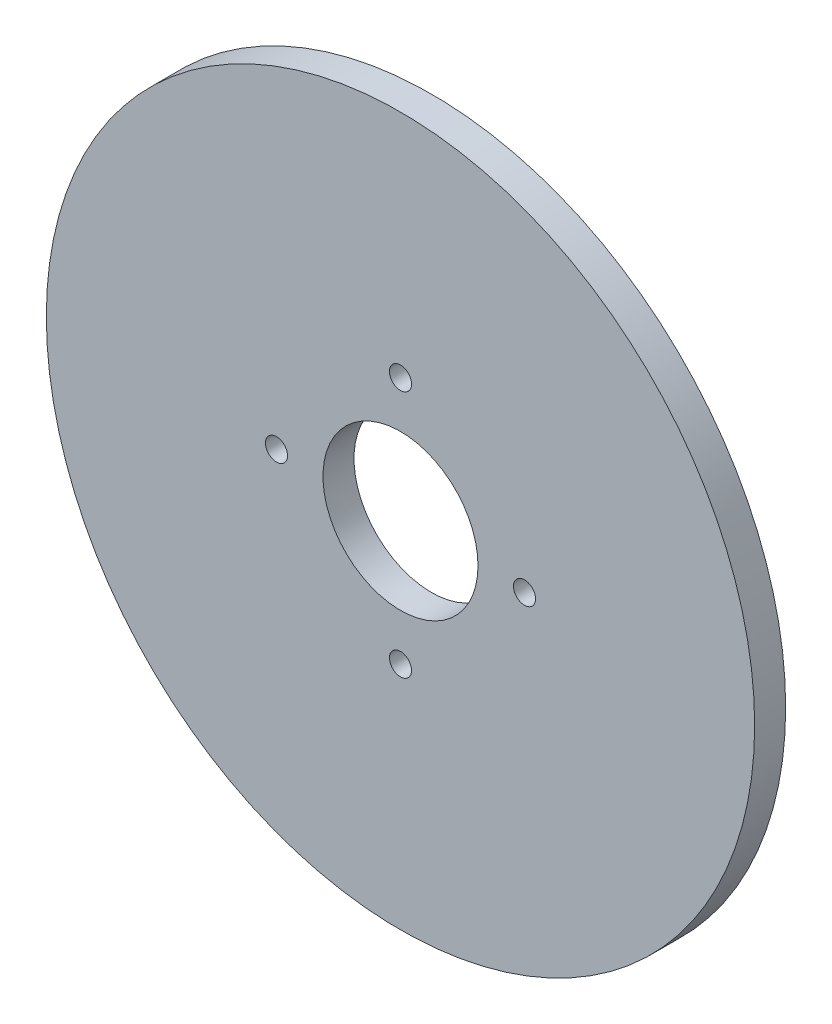
ISO-10303-21;
HEADER;
FILE_DESCRIPTION(('STEP AP214'),'2;1');
FILE_NAME('part.step','',(''),(''),'','','');
FILE_SCHEMA(('AUTOMOTIVE_DESIGN { 1 0 10303 214 1 1 1 1 }'));
ENDSEC;
DATA;
#1=APPLICATION_CONTEXT('core data for automotive mechanical design processes');
#2=APPLICATION_PROTOCOL_DEFINITION('international standard','automotive_design',2000,#1);
#3=PRODUCT_CONTEXT('',#1,'mechanical');
#4=PRODUCT('Part','Part','',(#3));
#5=PRODUCT_RELATED_PRODUCT_CATEGORY('part','',(#4));
#6=PRODUCT_DEFINITION_FORMATION('','',#4);
#7=PRODUCT_DEFINITION_CONTEXT('part definition',#1,'design');
#8=PRODUCT_DEFINITION('design','',#6,#7);
#9=PRODUCT_DEFINITION_SHAPE('','',#8);
#10=(LENGTH_UNIT() NAMED_UNIT(*) SI_UNIT(.MILLI.,.METRE.));
#11=(NAMED_UNIT(*) PLANE_ANGLE_UNIT() SI_UNIT($,.RADIAN.));
#12=(NAMED_UNIT(*) SI_UNIT($,.STERADIAN.) SOLID_ANGLE_UNIT());
#13=UNCERTAINTY_MEASURE_WITH_UNIT(LENGTH_MEASURE(1.E-05),#10,'distance_accuracy_value','');
#14=(GEOMETRIC_REPRESENTATION_CONTEXT(3) GLOBAL_UNCERTAINTY_ASSIGNED_CONTEXT((#13)) GLOBAL_UNIT_ASSIGNED_CONTEXT((#10,
#11,#12)) REPRESENTATION_CONTEXT('',''));
#15=CARTESIAN_POINT('',(0.,0.,0.));
#16=DIRECTION('',(0.,0.,1.));
#17=DIRECTION('',(1.,0.,0.));
#18=AXIS2_PLACEMENT_3D('',#15,#16,#17);
#19=CARTESIAN_POINT('',(0.,0.,3.175));
#20=DIRECTION('',(0.,0.,1.));
#21=DIRECTION('',(1.,0.,0.));
#22=AXIS2_PLACEMENT_3D('',#19,#20,#21);
#23=PLANE('',#22);
#24=CARTESIAN_POINT('',(0.,12.7,3.175));
#25=DIRECTION('',(0.,0.,1.));
#26=DIRECTION('',(1.,0.,0.));
#27=AXIS2_PLACEMENT_3D('',#24,#25,#26);
#28=CIRCLE('',#27,1.1303);
#29=CARTESIAN_POINT('',(1.1303,12.7,3.175));
#30=VERTEX_POINT('',#29);
#31=EDGE_CURVE('E68',#30,#30,#28,.T.);
#32=ORIENTED_EDGE('',*,*,#31,.F.);
#33=EDGE_LOOP('',(#32));
#34=FACE_BOUND('',#33,.T.);
#35=CARTESIAN_POINT('',(0.,-12.7,3.175));
#36=DIRECTION('',(0.,0.,1.));
#37=DIRECTION('',(1.,0.,0.));
#38=AXIS2_PLACEMENT_3D('',#35,#36,#37);
#39=CIRCLE('',#38,1.1303);
#40=CARTESIAN_POINT('',(1.1303,-12.7,3.175));
#41=VERTEX_POINT('',#40);
#42=EDGE_CURVE('E65',#41,#41,#39,.T.);
#43=ORIENTED_EDGE('',*,*,#42,.F.);
#44=EDGE_LOOP('',(#43));
#45=FACE_BOUND('',#44,.T.);
#46=CARTESIAN_POINT('',(12.7,0.,3.175));
#47=DIRECTION('',(0.,0.,1.));
#48=DIRECTION('',(1.,0.,0.));
#49=AXIS2_PLACEMENT_3D('',#46,#47,#48);
#50=CIRCLE('',#49,1.1303);
#51=CARTESIAN_POINT('',(13.8303,0.,3.175));
#52=VERTEX_POINT('',#51);
#53=EDGE_CURVE('E59',#52,#52,#50,.T.);
#54=ORIENTED_EDGE('',*,*,#53,.F.);
#55=EDGE_LOOP('',(#54));
#56=FACE_BOUND('',#55,.T.);
#57=CARTESIAN_POINT('',(-12.7,0.,3.175));
#58=DIRECTION('',(0.,0.,1.));
#59=DIRECTION('',(1.,0.,0.));
#60=AXIS2_PLACEMENT_3D('',#57,#58,#59);
#61=CIRCLE('',#60,1.1303);
#62=CARTESIAN_POINT('',(-11.5697,0.,3.175));
#63=VERTEX_POINT('',#62);
#64=EDGE_CURVE('E53',#63,#63,#61,.T.);
#65=ORIENTED_EDGE('',*,*,#64,.F.);
#66=EDGE_LOOP('',(#65));
#67=FACE_BOUND('',#66,.T.);
#68=CARTESIAN_POINT('',(0.,0.,3.175));
#69=DIRECTION('',(0.,0.,1.));
#70=DIRECTION('',(1.,0.,0.));
#71=AXIS2_PLACEMENT_3D('',#68,#69,#70);
#72=CIRCLE('',#71,36.2712);
#73=CARTESIAN_POINT('',(36.2712,0.,3.175));
#74=VERTEX_POINT('',#73);
#75=EDGE_CURVE('E10',#74,#74,#72,.T.);
#76=ORIENTED_EDGE('',*,*,#75,.T.);
#77=EDGE_LOOP('',(#76));
#78=FACE_BOUND('',#77,.T.);
#79=CARTESIAN_POINT('',(0.,0.,3.175));
#80=DIRECTION('',(0.,0.,1.));
#81=DIRECTION('',(1.,0.,0.));
#82=AXIS2_PLACEMENT_3D('',#79,#80,#81);
#83=CIRCLE('',#82,7.9375);
#84=CARTESIAN_POINT('',(7.9375,0.,3.175));
#85=VERTEX_POINT('',#84);
#86=EDGE_CURVE('E43',#85,#85,#83,.T.);
#87=ORIENTED_EDGE('',*,*,#86,.F.);
#88=EDGE_LOOP('',(#87));
#89=FACE_BOUND('',#88,.T.);
#90=ADVANCED_FACE('F30',(#34,#45,#56,#67,#78,#89),#23,.T.);
#91=CARTESIAN_POINT('',(0.,0.,0.));
#92=DIRECTION('',(0.,0.,1.));
#93=DIRECTION('',(1.,0.,0.));
#94=AXIS2_PLACEMENT_3D('',#91,#92,#93);
#95=PLANE('',#94);
#96=CARTESIAN_POINT('',(0.,12.7,0.));
#97=DIRECTION('',(0.,0.,1.));
#98=DIRECTION('',(1.,0.,0.));
#99=AXIS2_PLACEMENT_3D('',#96,#97,#98);
#100=CIRCLE('',#99,1.1303);
#101=CARTESIAN_POINT('',(1.1303,12.7,0.));
#102=VERTEX_POINT('',#101);
#103=EDGE_CURVE('E34',#102,#102,#100,.T.);
#104=ORIENTED_EDGE('',*,*,#103,.T.);
#105=EDGE_LOOP('',(#104));
#106=FACE_BOUND('',#105,.T.);
#107=CARTESIAN_POINT('',(0.,-12.7,0.));
#108=DIRECTION('',(0.,0.,1.));
#109=DIRECTION('',(1.,0.,0.));
#110=AXIS2_PLACEMENT_3D('',#107,#108,#109);
#111=CIRCLE('',#110,1.1303);
#112=CARTESIAN_POINT('',(1.1303,-12.7,0.));
#113=VERTEX_POINT('',#112);
#114=EDGE_CURVE('E62',#113,#113,#111,.T.);
#115=ORIENTED_EDGE('',*,*,#114,.T.);
#116=EDGE_LOOP('',(#115));
#117=FACE_BOUND('',#116,.T.);
#118=CARTESIAN_POINT('',(12.7,0.,0.));
#119=DIRECTION('',(0.,0.,1.));
#120=DIRECTION('',(1.,0.,0.));
#121=AXIS2_PLACEMENT_3D('',#118,#119,#120);
#122=CIRCLE('',#121,1.1303);
#123=CARTESIAN_POINT('',(13.8303,0.,0.));
#124=VERTEX_POINT('',#123);
#125=EDGE_CURVE('E56',#124,#124,#122,.T.);
#126=ORIENTED_EDGE('',*,*,#125,.T.);
#127=EDGE_LOOP('',(#126));
#128=FACE_BOUND('',#127,.T.);
#129=CARTESIAN_POINT('',(-12.7,0.,0.));
#130=DIRECTION('',(0.,0.,1.));
#131=DIRECTION('',(1.,0.,0.));
#132=AXIS2_PLACEMENT_3D('',#129,#130,#131);
#133=CIRCLE('',#132,1.1303);
#134=CARTESIAN_POINT('',(-11.5697,0.,0.));
#135=VERTEX_POINT('',#134);
#136=EDGE_CURVE('E48',#135,#135,#133,.T.);
#137=ORIENTED_EDGE('',*,*,#136,.T.);
#138=EDGE_LOOP('',(#137));
#139=FACE_BOUND('',#138,.T.);
#140=CARTESIAN_POINT('',(0.,0.,0.));
#141=DIRECTION('',(0.,0.,1.));
#142=DIRECTION('',(1.,0.,0.));
#143=AXIS2_PLACEMENT_3D('',#140,#141,#142);
#144=CIRCLE('',#143,36.2712);
#145=CARTESIAN_POINT('',(36.2712,0.,0.));
#146=VERTEX_POINT('',#145);
#147=EDGE_CURVE('E38',#146,#146,#144,.T.);
#148=ORIENTED_EDGE('',*,*,#147,.F.);
#149=EDGE_LOOP('',(#148));
#150=FACE_BOUND('',#149,.T.);
#151=CARTESIAN_POINT('',(0.,0.,0.));
#152=DIRECTION('',(0.,0.,1.));
#153=DIRECTION('',(1.,0.,0.));
#154=AXIS2_PLACEMENT_3D('',#151,#152,#153);
#155=CIRCLE('',#154,7.9375);
#156=CARTESIAN_POINT('',(7.9375,0.,0.));
#157=VERTEX_POINT('',#156);
#158=EDGE_CURVE('E45',#157,#157,#155,.T.);
#159=ORIENTED_EDGE('',*,*,#158,.T.);
#160=EDGE_LOOP('',(#159));
#161=FACE_BOUND('',#160,.T.);
#162=ADVANCED_FACE('F75',(#106,#117,#128,#139,#150,#161),#95,.F.);
#163=CARTESIAN_POINT('',(0.,0.,3.175));
#164=DIRECTION('',(0.,0.,-1.));
#165=DIRECTION('',(-1.,0.,0.));
#166=AXIS2_PLACEMENT_3D('',#163,#164,#165);
#167=CYLINDRICAL_SURFACE('',#166,36.2712);
#168=ORIENTED_EDGE('',*,*,#75,.F.);
#169=EDGE_LOOP('',(#168));
#170=FACE_BOUND('',#169,.T.);
#171=ORIENTED_EDGE('',*,*,#147,.T.);
#172=EDGE_LOOP('',(#171));
#173=FACE_BOUND('',#172,.T.);
#174=ADVANCED_FACE('F32',(#170,#173),#167,.T.);
#175=CARTESIAN_POINT('',(0.,0.,3.175));
#176=DIRECTION('',(0.,0.,-1.));
#177=DIRECTION('',(-1.,0.,0.));
#178=AXIS2_PLACEMENT_3D('',#175,#176,#177);
#179=CYLINDRICAL_SURFACE('',#178,7.9375);
#180=ORIENTED_EDGE('',*,*,#86,.T.);
#181=EDGE_LOOP('',(#180));
#182=FACE_BOUND('',#181,.T.);
#183=ORIENTED_EDGE('',*,*,#158,.F.);
#184=EDGE_LOOP('',(#183));
#185=FACE_BOUND('',#184,.T.);
#186=ADVANCED_FACE('F96',(#182,#185),#179,.F.);
#187=CARTESIAN_POINT('',(-12.7,0.,3.175));
#188=DIRECTION('',(0.,0.,1.));
#189=DIRECTION('',(1.,0.,0.));
#190=AXIS2_PLACEMENT_3D('',#187,#188,#189);
#191=CYLINDRICAL_SURFACE('',#190,1.1303);
#192=ORIENTED_EDGE('',*,*,#64,.T.);
#193=EDGE_LOOP('',(#192));
#194=FACE_BOUND('',#193,.T.);
#195=ORIENTED_EDGE('',*,*,#136,.F.);
#196=EDGE_LOOP('',(#195));
#197=FACE_BOUND('',#196,.T.);
#198=ADVANCED_FACE('F99',(#194,#197),#191,.F.);
#199=CARTESIAN_POINT('',(12.7,0.,3.175));
#200=DIRECTION('',(0.,0.,1.));
#201=DIRECTION('',(1.,0.,0.));
#202=AXIS2_PLACEMENT_3D('',#199,#200,#201);
#203=CYLINDRICAL_SURFACE('',#202,1.1303);
#204=ORIENTED_EDGE('',*,*,#53,.T.);
#205=EDGE_LOOP('',(#204));
#206=FACE_BOUND('',#205,.T.);
#207=ORIENTED_EDGE('',*,*,#125,.F.);
#208=EDGE_LOOP('',(#207));
#209=FACE_BOUND('',#208,.T.);
#210=ADVANCED_FACE('F85',(#206,#209),#203,.F.);
#211=CARTESIAN_POINT('',(0.,-12.7,3.175));
#212=DIRECTION('',(0.,0.,1.));
#213=DIRECTION('',(1.,0.,0.));
#214=AXIS2_PLACEMENT_3D('',#211,#212,#213);
#215=CYLINDRICAL_SURFACE('',#214,1.1303);
#216=ORIENTED_EDGE('',*,*,#42,.T.);
#217=EDGE_LOOP('',(#216));
#218=FACE_BOUND('',#217,.T.);
#219=ORIENTED_EDGE('',*,*,#114,.F.);
#220=EDGE_LOOP('',(#219));
#221=FACE_BOUND('',#220,.T.);
#222=ADVANCED_FACE('F80',(#218,#221),#215,.F.);
#223=CARTESIAN_POINT('',(0.,12.7,3.175));
#224=DIRECTION('',(0.,0.,1.));
#225=DIRECTION('',(1.,0.,0.));
#226=AXIS2_PLACEMENT_3D('',#223,#224,#225);
#227=CYLINDRICAL_SURFACE('',#226,1.1303);
#228=ORIENTED_EDGE('',*,*,#31,.T.);
#229=EDGE_LOOP('',(#228));
#230=FACE_BOUND('',#229,.T.);
#231=ORIENTED_EDGE('',*,*,#103,.F.);
#232=EDGE_LOOP('',(#231));
#233=FACE_BOUND('',#232,.T.);
#234=ADVANCED_FACE('F78',(#230,#233),#227,.F.);
#235=CLOSED_SHELL('',(#90,#162,#174,#186,#198,#210,#222,#234));
#236=MANIFOLD_SOLID_BREP('B2',#235);
#237=ADVANCED_BREP_SHAPE_REPRESENTATION('',(#18,#236),#14);
#238=SHAPE_DEFINITION_REPRESENTATION(#9,#237);
ENDSEC;
END-ISO-10303-21;
